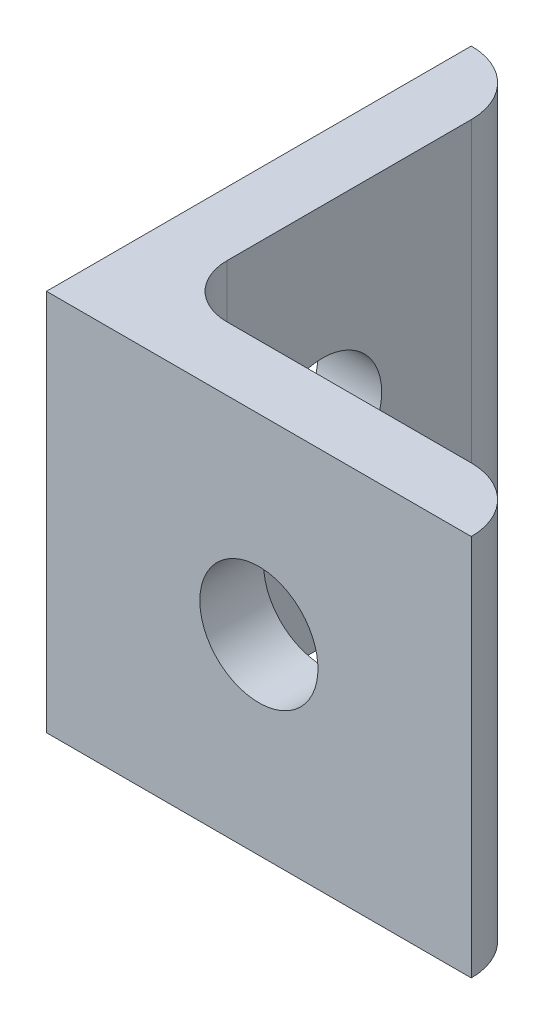
ISO-10303-21;
HEADER;
FILE_DESCRIPTION(('STEP AP214'),'2;1');
FILE_NAME('part.step','',(''),(''),'','','');
FILE_SCHEMA(('AUTOMOTIVE_DESIGN { 1 0 10303 214 1 1 1 1 }'));
ENDSEC;
DATA;
#1=APPLICATION_CONTEXT('core data for automotive mechanical design processes');
#2=APPLICATION_PROTOCOL_DEFINITION('international standard','automotive_design',2000,#1);
#3=PRODUCT_CONTEXT('',#1,'mechanical');
#4=PRODUCT('Part','Part','',(#3));
#5=PRODUCT_RELATED_PRODUCT_CATEGORY('part','',(#4));
#6=PRODUCT_DEFINITION_FORMATION('','',#4);
#7=PRODUCT_DEFINITION_CONTEXT('part definition',#1,'design');
#8=PRODUCT_DEFINITION('design','',#6,#7);
#9=PRODUCT_DEFINITION_SHAPE('','',#8);
#10=(LENGTH_UNIT() NAMED_UNIT(*) SI_UNIT(.MILLI.,.METRE.));
#11=(NAMED_UNIT(*) PLANE_ANGLE_UNIT() SI_UNIT($,.RADIAN.));
#12=(NAMED_UNIT(*) SI_UNIT($,.STERADIAN.) SOLID_ANGLE_UNIT());
#13=UNCERTAINTY_MEASURE_WITH_UNIT(LENGTH_MEASURE(1.E-05),#10,'distance_accuracy_value','');
#14=(GEOMETRIC_REPRESENTATION_CONTEXT(3) GLOBAL_UNCERTAINTY_ASSIGNED_CONTEXT((#13)) GLOBAL_UNIT_ASSIGNED_CONTEXT((#10,
#11,#12)) REPRESENTATION_CONTEXT('',''));
#15=CARTESIAN_POINT('',(0.,0.,0.));
#16=DIRECTION('',(0.,0.,1.));
#17=DIRECTION('',(1.,0.,0.));
#18=AXIS2_PLACEMENT_3D('',#15,#16,#17);
#19=CARTESIAN_POINT('',(0.,9.,0.));
#20=DIRECTION('',(0.,0.,-1.));
#21=DIRECTION('',(-1.,0.,0.));
#22=AXIS2_PLACEMENT_3D('',#19,#20,#21);
#23=PLANE('',#22);
#24=CARTESIAN_POINT('',(10.,0.,0.));
#25=DIRECTION('',(0.,0.,-1.));
#26=DIRECTION('',(-1.,0.,0.));
#27=AXIS2_PLACEMENT_3D('',#24,#25,#26);
#28=CIRCLE('',#27,2.78);
#29=CARTESIAN_POINT('',(7.22,0.,0.));
#30=VERTEX_POINT('',#29);
#31=EDGE_CURVE('E139',#30,#30,#28,.T.);
#32=ORIENTED_EDGE('',*,*,#31,.T.);
#33=EDGE_LOOP('',(#32));
#34=FACE_BOUND('',#33,.T.);
#35=DIRECTION('',(1.,0.,0.));
#36=VECTOR('',#35,1.);
#37=CARTESIAN_POINT('',(0.,-9.,0.));
#38=LINE('',#37,#36);
#39=CARTESIAN_POINT('',(0.,-9.,0.));
#40=VERTEX_POINT('',#39);
#41=CARTESIAN_POINT('',(20.,-9.,0.));
#42=VERTEX_POINT('',#41);
#43=EDGE_CURVE('E134',#40,#42,#38,.T.);
#44=ORIENTED_EDGE('',*,*,#43,.T.);
#45=DIRECTION('',(0.,-1.,0.));
#46=VECTOR('',#45,1.);
#47=CARTESIAN_POINT('',(20.,9.,0.));
#48=LINE('',#47,#46);
#49=CARTESIAN_POINT('',(20.,9.,0.));
#50=VERTEX_POINT('',#49);
#51=EDGE_CURVE('E11',#50,#42,#48,.T.);
#52=ORIENTED_EDGE('',*,*,#51,.F.);
#53=DIRECTION('',(1.,0.,0.));
#54=VECTOR('',#53,1.);
#55=CARTESIAN_POINT('',(0.,9.,0.));
#56=LINE('',#55,#54);
#57=CARTESIAN_POINT('',(0.,9.,0.));
#58=VERTEX_POINT('',#57);
#59=EDGE_CURVE('E154',#58,#50,#56,.T.);
#60=ORIENTED_EDGE('',*,*,#59,.F.);
#61=DIRECTION('',(0.,-1.,0.));
#62=VECTOR('',#61,1.);
#63=CARTESIAN_POINT('',(0.,9.,0.));
#64=LINE('',#63,#62);
#65=EDGE_CURVE('E130',#58,#40,#64,.T.);
#66=ORIENTED_EDGE('',*,*,#65,.T.);
#67=EDGE_LOOP('',(#44,#52,#60,#66));
#68=FACE_BOUND('',#67,.T.);
#69=ADVANCED_FACE('F39',(#34,#68),#23,.F.);
#70=CARTESIAN_POINT('',(17.,9.,0.));
#71=DIRECTION('',(0.,-1.,0.));
#72=DIRECTION('',(0.,0.,-1.));
#73=AXIS2_PLACEMENT_3D('',#70,#71,#72);
#74=CYLINDRICAL_SURFACE('',#73,3.);
#75=CARTESIAN_POINT('',(17.,-9.,0.));
#76=DIRECTION('',(0.,1.,0.));
#77=DIRECTION('',(0.,0.,1.));
#78=AXIS2_PLACEMENT_3D('',#75,#76,#77);
#79=CIRCLE('',#78,3.);
#80=CARTESIAN_POINT('',(17.,-9.,-3.));
#81=VERTEX_POINT('',#80);
#82=EDGE_CURVE('E138',#42,#81,#79,.T.);
#83=ORIENTED_EDGE('',*,*,#82,.T.);
#84=DIRECTION('',(0.,-1.,0.));
#85=VECTOR('',#84,1.);
#86=CARTESIAN_POINT('',(17.,9.,-3.));
#87=LINE('',#86,#85);
#88=CARTESIAN_POINT('',(17.,9.,-3.));
#89=VERTEX_POINT('',#88);
#90=EDGE_CURVE('E48',#89,#81,#87,.T.);
#91=ORIENTED_EDGE('',*,*,#90,.F.);
#92=CARTESIAN_POINT('',(17.,9.,0.));
#93=DIRECTION('',(0.,1.,0.));
#94=DIRECTION('',(0.,0.,1.));
#95=AXIS2_PLACEMENT_3D('',#92,#93,#94);
#96=CIRCLE('',#95,3.);
#97=EDGE_CURVE('E96',#50,#89,#96,.T.);
#98=ORIENTED_EDGE('',*,*,#97,.F.);
#99=ORIENTED_EDGE('',*,*,#51,.T.);
#100=EDGE_LOOP('',(#83,#91,#98,#99));
#101=FACE_BOUND('',#100,.T.);
#102=ADVANCED_FACE('F220',(#101),#74,.T.);
#103=CARTESIAN_POINT('',(5.50000000000002,9.,-3.));
#104=DIRECTION('',(0.,0.,1.));
#105=DIRECTION('',(1.,0.,0.));
#106=AXIS2_PLACEMENT_3D('',#103,#104,#105);
#107=PLANE('',#106);
#108=CARTESIAN_POINT('',(10.,0.,-3.));
#109=DIRECTION('',(0.,0.,-1.));
#110=DIRECTION('',(-1.,0.,0.));
#111=AXIS2_PLACEMENT_3D('',#108,#109,#110);
#112=CIRCLE('',#111,2.78);
#113=CARTESIAN_POINT('',(7.22,0.,-3.));
#114=VERTEX_POINT('',#113);
#115=EDGE_CURVE('E186',#114,#114,#112,.T.);
#116=ORIENTED_EDGE('',*,*,#115,.F.);
#117=EDGE_LOOP('',(#116));
#118=FACE_BOUND('',#117,.T.);
#119=DIRECTION('',(-1.,0.,0.));
#120=VECTOR('',#119,1.);
#121=CARTESIAN_POINT('',(5.50000000000002,-9.,-3.));
#122=LINE('',#121,#120);
#123=CARTESIAN_POINT('',(5.50000000000002,-9.,-3.));
#124=VERTEX_POINT('',#123);
#125=EDGE_CURVE('E142',#81,#124,#122,.T.);
#126=ORIENTED_EDGE('',*,*,#125,.T.);
#127=DIRECTION('',(0.,-1.,0.));
#128=VECTOR('',#127,1.);
#129=CARTESIAN_POINT('',(5.50000000000002,9.,-3.));
#130=LINE('',#129,#128);
#131=CARTESIAN_POINT('',(5.50000000000002,9.,-3.));
#132=VERTEX_POINT('',#131);
#133=EDGE_CURVE('E161',#132,#124,#130,.T.);
#134=ORIENTED_EDGE('',*,*,#133,.F.);
#135=DIRECTION('',(-1.,0.,0.));
#136=VECTOR('',#135,1.);
#137=CARTESIAN_POINT('',(5.50000000000002,9.,-3.));
#138=LINE('',#137,#136);
#139=EDGE_CURVE('E171',#89,#132,#138,.T.);
#140=ORIENTED_EDGE('',*,*,#139,.F.);
#141=ORIENTED_EDGE('',*,*,#90,.T.);
#142=EDGE_LOOP('',(#126,#134,#140,#141));
#143=FACE_BOUND('',#142,.T.);
#144=ADVANCED_FACE('F169',(#118,#143),#107,.F.);
#145=CARTESIAN_POINT('',(5.5,9.,-5.5));
#146=DIRECTION('',(0.,-1.,0.));
#147=DIRECTION('',(0.,0.,-1.));
#148=AXIS2_PLACEMENT_3D('',#145,#146,#147);
#149=CYLINDRICAL_SURFACE('',#148,2.5);
#150=CARTESIAN_POINT('',(5.5,-9.,-5.5));
#151=DIRECTION('',(0.,-1.,0.));
#152=DIRECTION('',(0.,0.,-1.));
#153=AXIS2_PLACEMENT_3D('',#150,#151,#152);
#154=CIRCLE('',#153,2.5);
#155=CARTESIAN_POINT('',(3.,-9.,-5.50000000000002));
#156=VERTEX_POINT('',#155);
#157=EDGE_CURVE('E145',#124,#156,#154,.T.);
#158=ORIENTED_EDGE('',*,*,#157,.T.);
#159=DIRECTION('',(0.,-1.,0.));
#160=VECTOR('',#159,1.);
#161=CARTESIAN_POINT('',(3.,9.,-5.50000000000002));
#162=LINE('',#161,#160);
#163=CARTESIAN_POINT('',(3.,9.,-5.50000000000002));
#164=VERTEX_POINT('',#163);
#165=EDGE_CURVE('E123',#164,#156,#162,.T.);
#166=ORIENTED_EDGE('',*,*,#165,.F.);
#167=CARTESIAN_POINT('',(5.5,9.,-5.5));
#168=DIRECTION('',(0.,-1.,0.));
#169=DIRECTION('',(0.,0.,-1.));
#170=AXIS2_PLACEMENT_3D('',#167,#168,#169);
#171=CIRCLE('',#170,2.5);
#172=EDGE_CURVE('E112',#132,#164,#171,.T.);
#173=ORIENTED_EDGE('',*,*,#172,.F.);
#174=ORIENTED_EDGE('',*,*,#133,.T.);
#175=EDGE_LOOP('',(#158,#166,#173,#174));
#176=FACE_BOUND('',#175,.T.);
#177=ADVANCED_FACE('F177',(#176),#149,.F.);
#178=CARTESIAN_POINT('',(3.,9.,-17.));
#179=DIRECTION('',(-1.,0.,0.));
#180=DIRECTION('',(0.,0.,1.));
#181=AXIS2_PLACEMENT_3D('',#178,#179,#180);
#182=PLANE('',#181);
#183=CARTESIAN_POINT('',(3.,0.,-10.));
#184=DIRECTION('',(1.,0.,0.));
#185=DIRECTION('',(0.,0.,-1.));
#186=AXIS2_PLACEMENT_3D('',#183,#184,#185);
#187=CIRCLE('',#186,2.78);
#188=CARTESIAN_POINT('',(3.,0.,-12.78));
#189=VERTEX_POINT('',#188);
#190=EDGE_CURVE('E194',#189,#189,#187,.T.);
#191=ORIENTED_EDGE('',*,*,#190,.F.);
#192=EDGE_LOOP('',(#191));
#193=FACE_BOUND('',#192,.T.);
#194=DIRECTION('',(0.,0.,-1.));
#195=VECTOR('',#194,1.);
#196=CARTESIAN_POINT('',(3.,-9.,-17.));
#197=LINE('',#196,#195);
#198=CARTESIAN_POINT('',(3.,-9.,-17.));
#199=VERTEX_POINT('',#198);
#200=EDGE_CURVE('E121',#156,#199,#197,.T.);
#201=ORIENTED_EDGE('',*,*,#200,.T.);
#202=DIRECTION('',(0.,-1.,0.));
#203=VECTOR('',#202,1.);
#204=CARTESIAN_POINT('',(3.,9.,-17.));
#205=LINE('',#204,#203);
#206=CARTESIAN_POINT('',(3.,9.,-17.));
#207=VERTEX_POINT('',#206);
#208=EDGE_CURVE('E118',#207,#199,#205,.T.);
#209=ORIENTED_EDGE('',*,*,#208,.F.);
#210=DIRECTION('',(0.,0.,-1.));
#211=VECTOR('',#210,1.);
#212=CARTESIAN_POINT('',(3.,9.,-17.));
#213=LINE('',#212,#211);
#214=EDGE_CURVE('E106',#164,#207,#213,.T.);
#215=ORIENTED_EDGE('',*,*,#214,.F.);
#216=ORIENTED_EDGE('',*,*,#165,.T.);
#217=EDGE_LOOP('',(#201,#209,#215,#216));
#218=FACE_BOUND('',#217,.T.);
#219=ADVANCED_FACE('F119',(#193,#218),#182,.F.);
#220=CARTESIAN_POINT('',(0.,9.,-17.));
#221=DIRECTION('',(0.,-1.,0.));
#222=DIRECTION('',(0.,0.,-1.));
#223=AXIS2_PLACEMENT_3D('',#220,#221,#222);
#224=CYLINDRICAL_SURFACE('',#223,3.);
#225=CARTESIAN_POINT('',(0.,-9.,-17.));
#226=DIRECTION('',(0.,1.,0.));
#227=DIRECTION('',(0.,0.,-1.));
#228=AXIS2_PLACEMENT_3D('',#225,#226,#227);
#229=CIRCLE('',#228,3.);
#230=CARTESIAN_POINT('',(0.,-9.,-20.));
#231=VERTEX_POINT('',#230);
#232=EDGE_CURVE('E82',#199,#231,#229,.T.);
#233=ORIENTED_EDGE('',*,*,#232,.T.);
#234=DIRECTION('',(0.,-1.,0.));
#235=VECTOR('',#234,1.);
#236=CARTESIAN_POINT('',(0.,9.,-20.));
#237=LINE('',#236,#235);
#238=CARTESIAN_POINT('',(0.,9.,-20.));
#239=VERTEX_POINT('',#238);
#240=EDGE_CURVE('E124',#239,#231,#237,.T.);
#241=ORIENTED_EDGE('',*,*,#240,.F.);
#242=CARTESIAN_POINT('',(0.,9.,-17.));
#243=DIRECTION('',(0.,1.,0.));
#244=DIRECTION('',(0.,0.,-1.));
#245=AXIS2_PLACEMENT_3D('',#242,#243,#244);
#246=CIRCLE('',#245,3.);
#247=EDGE_CURVE('E110',#207,#239,#246,.T.);
#248=ORIENTED_EDGE('',*,*,#247,.F.);
#249=ORIENTED_EDGE('',*,*,#208,.T.);
#250=EDGE_LOOP('',(#233,#241,#248,#249));
#251=FACE_BOUND('',#250,.T.);
#252=ADVANCED_FACE('F126',(#251),#224,.T.);
#253=CARTESIAN_POINT('',(0.,9.,0.));
#254=DIRECTION('',(1.,0.,0.));
#255=DIRECTION('',(0.,0.,-1.));
#256=AXIS2_PLACEMENT_3D('',#253,#254,#255);
#257=PLANE('',#256);
#258=CARTESIAN_POINT('',(0.,0.,-10.));
#259=DIRECTION('',(1.,0.,0.));
#260=DIRECTION('',(0.,0.,-1.));
#261=AXIS2_PLACEMENT_3D('',#258,#259,#260);
#262=CIRCLE('',#261,2.78);
#263=CARTESIAN_POINT('',(0.,0.,-12.78));
#264=VERTEX_POINT('',#263);
#265=EDGE_CURVE('E190',#264,#264,#262,.T.);
#266=ORIENTED_EDGE('',*,*,#265,.T.);
#267=EDGE_LOOP('',(#266));
#268=FACE_BOUND('',#267,.T.);
#269=DIRECTION('',(0.,0.,1.));
#270=VECTOR('',#269,1.);
#271=CARTESIAN_POINT('',(0.,-9.,0.));
#272=LINE('',#271,#270);
#273=EDGE_CURVE('E88',#231,#40,#272,.T.);
#274=ORIENTED_EDGE('',*,*,#273,.T.);
#275=ORIENTED_EDGE('',*,*,#65,.F.);
#276=DIRECTION('',(0.,0.,1.));
#277=VECTOR('',#276,1.);
#278=CARTESIAN_POINT('',(0.,9.,0.));
#279=LINE('',#278,#277);
#280=EDGE_CURVE('E56',#239,#58,#279,.T.);
#281=ORIENTED_EDGE('',*,*,#280,.F.);
#282=ORIENTED_EDGE('',*,*,#240,.T.);
#283=EDGE_LOOP('',(#274,#275,#281,#282));
#284=FACE_BOUND('',#283,.T.);
#285=ADVANCED_FACE('F202',(#268,#284),#257,.F.);
#286=CARTESIAN_POINT('',(17.,9.,0.));
#287=DIRECTION('',(0.,1.,0.));
#288=DIRECTION('',(0.,0.,1.));
#289=AXIS2_PLACEMENT_3D('',#286,#287,#288);
#290=PLANE('',#289);
#291=ORIENTED_EDGE('',*,*,#59,.T.);
#292=ORIENTED_EDGE('',*,*,#97,.T.);
#293=ORIENTED_EDGE('',*,*,#139,.T.);
#294=ORIENTED_EDGE('',*,*,#172,.T.);
#295=ORIENTED_EDGE('',*,*,#214,.T.);
#296=ORIENTED_EDGE('',*,*,#247,.T.);
#297=ORIENTED_EDGE('',*,*,#280,.T.);
#298=EDGE_LOOP('',(#291,#292,#293,#294,#295,#296,#297));
#299=FACE_BOUND('',#298,.T.);
#300=ADVANCED_FACE('F108',(#299),#290,.T.);
#301=CARTESIAN_POINT('',(17.,-9.,0.));
#302=DIRECTION('',(0.,1.,0.));
#303=DIRECTION('',(0.,0.,1.));
#304=AXIS2_PLACEMENT_3D('',#301,#302,#303);
#305=PLANE('',#304);
#306=ORIENTED_EDGE('',*,*,#43,.F.);
#307=ORIENTED_EDGE('',*,*,#273,.F.);
#308=ORIENTED_EDGE('',*,*,#232,.F.);
#309=ORIENTED_EDGE('',*,*,#200,.F.);
#310=ORIENTED_EDGE('',*,*,#157,.F.);
#311=ORIENTED_EDGE('',*,*,#125,.F.);
#312=ORIENTED_EDGE('',*,*,#82,.F.);
#313=EDGE_LOOP('',(#306,#307,#308,#309,#310,#311,#312));
#314=FACE_BOUND('',#313,.T.);
#315=ADVANCED_FACE('F175',(#314),#305,.F.);
#316=CARTESIAN_POINT('',(10.,0.,0.));
#317=DIRECTION('',(0.,0.,-1.));
#318=DIRECTION('',(-1.,0.,0.));
#319=AXIS2_PLACEMENT_3D('',#316,#317,#318);
#320=CYLINDRICAL_SURFACE('',#319,2.78);
#321=ORIENTED_EDGE('',*,*,#31,.F.);
#322=EDGE_LOOP('',(#321));
#323=FACE_BOUND('',#322,.T.);
#324=ORIENTED_EDGE('',*,*,#115,.T.);
#325=EDGE_LOOP('',(#324));
#326=FACE_BOUND('',#325,.T.);
#327=ADVANCED_FACE('F207',(#323,#326),#320,.F.);
#328=CARTESIAN_POINT('',(0.,0.,-10.));
#329=DIRECTION('',(1.,0.,0.));
#330=DIRECTION('',(0.,0.,-1.));
#331=AXIS2_PLACEMENT_3D('',#328,#329,#330);
#332=CYLINDRICAL_SURFACE('',#331,2.78);
#333=ORIENTED_EDGE('',*,*,#265,.F.);
#334=EDGE_LOOP('',(#333));
#335=FACE_BOUND('',#334,.T.);
#336=ORIENTED_EDGE('',*,*,#190,.T.);
#337=EDGE_LOOP('',(#336));
#338=FACE_BOUND('',#337,.T.);
#339=ADVANCED_FACE('F204',(#335,#338),#332,.F.);
#340=CLOSED_SHELL('',(#69,#102,#144,#177,#219,#252,#285,#300,#315,#327,#339));
#341=MANIFOLD_SOLID_BREP('B2',#340);
#342=ADVANCED_BREP_SHAPE_REPRESENTATION('',(#18,#341),#14);
#343=SHAPE_DEFINITION_REPRESENTATION(#9,#342);
ENDSEC;
END-ISO-10303-21;
